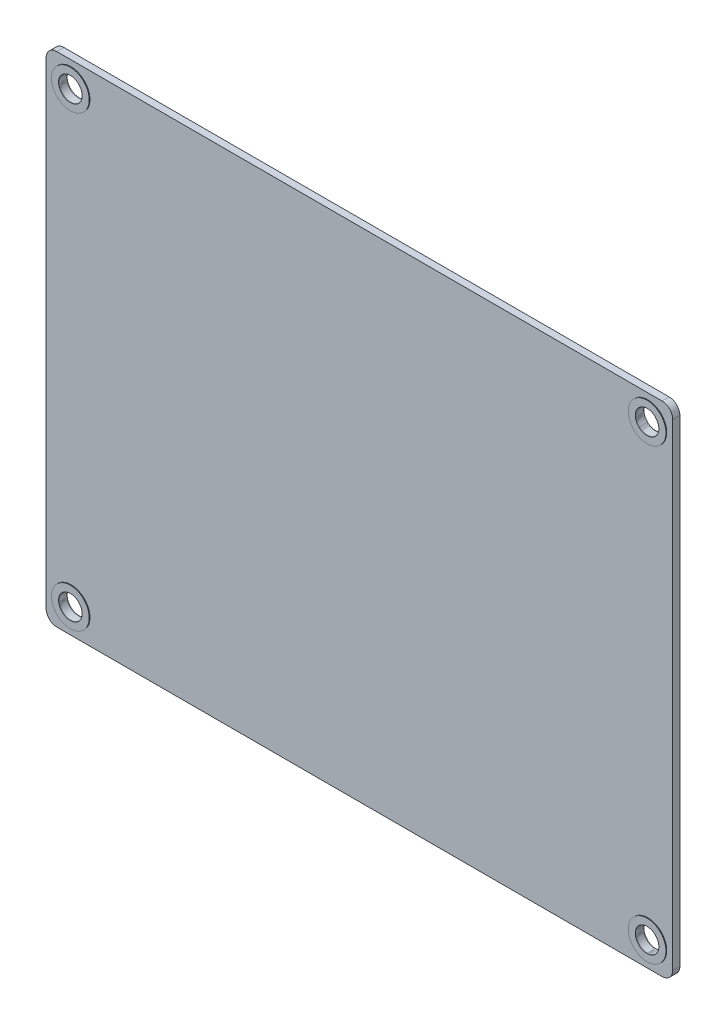
ISO-10303-21;
HEADER;
FILE_DESCRIPTION(('STEP AP214'),'2;1');
FILE_NAME('part.step','',(''),(''),'','','');
FILE_SCHEMA(('AUTOMOTIVE_DESIGN { 1 0 10303 214 1 1 1 1 }'));
ENDSEC;
DATA;
#1=APPLICATION_CONTEXT('core data for automotive mechanical design processes');
#2=APPLICATION_PROTOCOL_DEFINITION('international standard','automotive_design',2000,#1);
#3=PRODUCT_CONTEXT('',#1,'mechanical');
#4=PRODUCT('Part','Part','',(#3));
#5=PRODUCT_RELATED_PRODUCT_CATEGORY('part','',(#4));
#6=PRODUCT_DEFINITION_FORMATION('','',#4);
#7=PRODUCT_DEFINITION_CONTEXT('part definition',#1,'design');
#8=PRODUCT_DEFINITION('design','',#6,#7);
#9=PRODUCT_DEFINITION_SHAPE('','',#8);
#10=(LENGTH_UNIT() NAMED_UNIT(*) SI_UNIT(.MILLI.,.METRE.));
#11=(NAMED_UNIT(*) PLANE_ANGLE_UNIT() SI_UNIT($,.RADIAN.));
#12=(NAMED_UNIT(*) SI_UNIT($,.STERADIAN.) SOLID_ANGLE_UNIT());
#13=UNCERTAINTY_MEASURE_WITH_UNIT(LENGTH_MEASURE(1.E-05),#10,'distance_accuracy_value','');
#14=(GEOMETRIC_REPRESENTATION_CONTEXT(3) GLOBAL_UNCERTAINTY_ASSIGNED_CONTEXT((#13)) GLOBAL_UNIT_ASSIGNED_CONTEXT((#10,
#11,#12)) REPRESENTATION_CONTEXT('',''));
#15=CARTESIAN_POINT('',(0.,0.,0.));
#16=DIRECTION('',(0.,0.,1.));
#17=DIRECTION('',(1.,0.,0.));
#18=AXIS2_PLACEMENT_3D('',#15,#16,#17);
#19=CARTESIAN_POINT('',(36.5,-31.5,-7.6953318805774));
#20=DIRECTION('',(0.,0.,1.));
#21=DIRECTION('',(1.,0.,0.));
#22=AXIS2_PLACEMENT_3D('',#19,#20,#21);
#23=CYLINDRICAL_SURFACE('',#22,2.65);
#24=CARTESIAN_POINT('',(36.5,-31.5,-0.1));
#25=DIRECTION('',(0.,0.,1.));
#26=DIRECTION('',(1.,0.,0.));
#27=AXIS2_PLACEMENT_3D('',#24,#25,#26);
#28=CIRCLE('',#27,2.65);
#29=CARTESIAN_POINT('',(39.15,-31.5,-0.1));
#30=VERTEX_POINT('',#29);
#31=EDGE_CURVE('P0_E50',#30,#30,#28,.F.);
#32=ORIENTED_EDGE('',*,*,#31,.F.);
#33=EDGE_LOOP('',(#32));
#34=FACE_BOUND('',#33,.T.);
#35=CARTESIAN_POINT('',(36.5,-31.5,1.1));
#36=DIRECTION('',(0.,0.,1.));
#37=DIRECTION('',(1.,0.,0.));
#38=AXIS2_PLACEMENT_3D('',#35,#36,#37);
#39=CIRCLE('',#38,2.65);
#40=CARTESIAN_POINT('',(39.15,-31.5,1.1));
#41=VERTEX_POINT('',#40);
#42=EDGE_CURVE('P0_E56',#41,#41,#39,.T.);
#43=ORIENTED_EDGE('',*,*,#42,.F.);
#44=EDGE_LOOP('',(#43));
#45=FACE_BOUND('',#44,.T.);
#46=ADVANCED_FACE('P0_F43',(#34,#45),#23,.T.);
#47=CARTESIAN_POINT('',(36.5,-31.5,-7.6953318805774));
#48=DIRECTION('',(0.,0.,1.));
#49=DIRECTION('',(1.,0.,0.));
#50=AXIS2_PLACEMENT_3D('',#47,#48,#49);
#51=CYLINDRICAL_SURFACE('',#50,1.65);
#52=CARTESIAN_POINT('',(36.5,-31.5,-0.1));
#53=DIRECTION('',(0.,0.,1.));
#54=DIRECTION('',(1.,0.,0.));
#55=AXIS2_PLACEMENT_3D('',#52,#53,#54);
#56=CIRCLE('',#55,1.65);
#57=CARTESIAN_POINT('',(38.15,-31.5,-0.1));
#58=VERTEX_POINT('',#57);
#59=EDGE_CURVE('P0_E11',#58,#58,#56,.F.);
#60=ORIENTED_EDGE('',*,*,#59,.T.);
#61=EDGE_LOOP('',(#60));
#62=FACE_BOUND('',#61,.T.);
#63=CARTESIAN_POINT('',(36.5,-31.5,1.1));
#64=DIRECTION('',(0.,0.,1.));
#65=DIRECTION('',(1.,0.,0.));
#66=AXIS2_PLACEMENT_3D('',#63,#64,#65);
#67=CIRCLE('',#66,1.65);
#68=CARTESIAN_POINT('',(38.15,-31.5,1.1));
#69=VERTEX_POINT('',#68);
#70=EDGE_CURVE('P0_E61',#69,#69,#67,.T.);
#71=ORIENTED_EDGE('',*,*,#70,.T.);
#72=EDGE_LOOP('',(#71));
#73=FACE_BOUND('',#72,.T.);
#74=ADVANCED_FACE('P0_F67',(#62,#73),#51,.F.);
#75=CARTESIAN_POINT('',(0.,0.,-0.1));
#76=DIRECTION('',(0.,0.,1.));
#77=DIRECTION('',(1.,0.,0.));
#78=AXIS2_PLACEMENT_3D('',#75,#76,#77);
#79=PLANE('',#78);
#80=ORIENTED_EDGE('',*,*,#31,.T.);
#81=EDGE_LOOP('',(#80));
#82=FACE_BOUND('',#81,.T.);
#83=ORIENTED_EDGE('',*,*,#59,.F.);
#84=EDGE_LOOP('',(#83));
#85=FACE_BOUND('',#84,.T.);
#86=ADVANCED_FACE('P0_F71',(#82,#85),#79,.F.);
#87=CARTESIAN_POINT('',(36.5,-31.5,1.1));
#88=DIRECTION('',(0.,0.,1.));
#89=DIRECTION('',(1.,0.,0.));
#90=AXIS2_PLACEMENT_3D('',#87,#88,#89);
#91=PLANE('',#90);
#92=ORIENTED_EDGE('',*,*,#42,.T.);
#93=EDGE_LOOP('',(#92));
#94=FACE_BOUND('',#93,.T.);
#95=ORIENTED_EDGE('',*,*,#70,.F.);
#96=EDGE_LOOP('',(#95));
#97=FACE_BOUND('',#96,.T.);
#98=ADVANCED_FACE('P0_F69',(#94,#97),#91,.T.);
#99=CLOSED_SHELL('',(#46,#74,#86,#98));
#100=MANIFOLD_SOLID_BREP('P0_B2',#99);
#101=CARTESIAN_POINT('',(-44.5,-31.5,-7.6953318805774));
#102=DIRECTION('',(0.,0.,1.));
#103=DIRECTION('',(1.,0.,0.));
#104=AXIS2_PLACEMENT_3D('',#101,#102,#103);
#105=CYLINDRICAL_SURFACE('',#104,2.65);
#106=CARTESIAN_POINT('',(-44.5,-31.5,-0.1));
#107=DIRECTION('',(0.,0.,1.));
#108=DIRECTION('',(1.,0.,0.));
#109=AXIS2_PLACEMENT_3D('',#106,#107,#108);
#110=CIRCLE('',#109,2.65);
#111=CARTESIAN_POINT('',(-41.85,-31.5,-0.1));
#112=VERTEX_POINT('',#111);
#113=EDGE_CURVE('P0_E127',#112,#112,#110,.F.);
#114=ORIENTED_EDGE('',*,*,#113,.F.);
#115=EDGE_LOOP('',(#114));
#116=FACE_BOUND('',#115,.T.);
#117=CARTESIAN_POINT('',(-44.5,-31.5,1.1));
#118=DIRECTION('',(0.,0.,1.));
#119=DIRECTION('',(1.,0.,0.));
#120=AXIS2_PLACEMENT_3D('',#117,#118,#119);
#121=CIRCLE('',#120,2.65);
#122=CARTESIAN_POINT('',(-41.85,-31.5,1.1));
#123=VERTEX_POINT('',#122);
#124=EDGE_CURVE('P0_E133',#123,#123,#121,.T.);
#125=ORIENTED_EDGE('',*,*,#124,.F.);
#126=EDGE_LOOP('',(#125));
#127=FACE_BOUND('',#126,.T.);
#128=ADVANCED_FACE('P0_F120',(#116,#127),#105,.T.);
#129=CARTESIAN_POINT('',(-44.5,-31.5,-7.6953318805774));
#130=DIRECTION('',(0.,0.,1.));
#131=DIRECTION('',(1.,0.,0.));
#132=AXIS2_PLACEMENT_3D('',#129,#130,#131);
#133=CYLINDRICAL_SURFACE('',#132,1.65);
#134=CARTESIAN_POINT('',(-44.5,-31.5,-0.1));
#135=DIRECTION('',(0.,0.,1.));
#136=DIRECTION('',(1.,0.,0.));
#137=AXIS2_PLACEMENT_3D('',#134,#135,#136);
#138=CIRCLE('',#137,1.65);
#139=CARTESIAN_POINT('',(-42.85,-31.5,-0.1));
#140=VERTEX_POINT('',#139);
#141=EDGE_CURVE('P0_E42',#140,#140,#138,.F.);
#142=ORIENTED_EDGE('',*,*,#141,.T.);
#143=EDGE_LOOP('',(#142));
#144=FACE_BOUND('',#143,.T.);
#145=CARTESIAN_POINT('',(-44.5,-31.5,1.1));
#146=DIRECTION('',(0.,0.,1.));
#147=DIRECTION('',(1.,0.,0.));
#148=AXIS2_PLACEMENT_3D('',#145,#146,#147);
#149=CIRCLE('',#148,1.65);
#150=CARTESIAN_POINT('',(-42.85,-31.5,1.1));
#151=VERTEX_POINT('',#150);
#152=EDGE_CURVE('P0_E137',#151,#151,#149,.T.);
#153=ORIENTED_EDGE('',*,*,#152,.T.);
#154=EDGE_LOOP('',(#153));
#155=FACE_BOUND('',#154,.T.);
#156=ADVANCED_FACE('P0_F144',(#144,#155),#133,.F.);
#157=CARTESIAN_POINT('',(0.,0.,-0.1));
#158=DIRECTION('',(0.,0.,1.));
#159=DIRECTION('',(1.,0.,0.));
#160=AXIS2_PLACEMENT_3D('',#157,#158,#159);
#161=PLANE('',#160);
#162=ORIENTED_EDGE('',*,*,#113,.T.);
#163=EDGE_LOOP('',(#162));
#164=FACE_BOUND('',#163,.T.);
#165=ORIENTED_EDGE('',*,*,#141,.F.);
#166=EDGE_LOOP('',(#165));
#167=FACE_BOUND('',#166,.T.);
#168=ADVANCED_FACE('P0_F148',(#164,#167),#161,.F.);
#169=CARTESIAN_POINT('',(-44.5,-31.5,1.1));
#170=DIRECTION('',(0.,0.,1.));
#171=DIRECTION('',(1.,0.,0.));
#172=AXIS2_PLACEMENT_3D('',#169,#170,#171);
#173=PLANE('',#172);
#174=ORIENTED_EDGE('',*,*,#124,.T.);
#175=EDGE_LOOP('',(#174));
#176=FACE_BOUND('',#175,.T.);
#177=ORIENTED_EDGE('',*,*,#152,.F.);
#178=EDGE_LOOP('',(#177));
#179=FACE_BOUND('',#178,.T.);
#180=ADVANCED_FACE('P0_F146',(#176,#179),#173,.T.);
#181=CLOSED_SHELL('',(#128,#156,#168,#180));
#182=MANIFOLD_SOLID_BREP('P0_B6',#181);
#183=CARTESIAN_POINT('',(36.5,31.5,-7.6953318805774));
#184=DIRECTION('',(0.,0.,1.));
#185=DIRECTION('',(1.,0.,0.));
#186=AXIS2_PLACEMENT_3D('',#183,#184,#185);
#187=CYLINDRICAL_SURFACE('',#186,2.65);
#188=CARTESIAN_POINT('',(36.5,31.5,-0.1));
#189=DIRECTION('',(0.,0.,1.));
#190=DIRECTION('',(1.,0.,0.));
#191=AXIS2_PLACEMENT_3D('',#188,#189,#190);
#192=CIRCLE('',#191,2.65);
#193=CARTESIAN_POINT('',(39.15,31.5,-0.1));
#194=VERTEX_POINT('',#193);
#195=EDGE_CURVE('P0_E203',#194,#194,#192,.F.);
#196=ORIENTED_EDGE('',*,*,#195,.F.);
#197=EDGE_LOOP('',(#196));
#198=FACE_BOUND('',#197,.T.);
#199=CARTESIAN_POINT('',(36.5,31.5,1.1));
#200=DIRECTION('',(0.,0.,1.));
#201=DIRECTION('',(1.,0.,0.));
#202=AXIS2_PLACEMENT_3D('',#199,#200,#201);
#203=CIRCLE('',#202,2.65);
#204=CARTESIAN_POINT('',(39.15,31.5,1.1));
#205=VERTEX_POINT('',#204);
#206=EDGE_CURVE('P0_E209',#205,#205,#203,.T.);
#207=ORIENTED_EDGE('',*,*,#206,.F.);
#208=EDGE_LOOP('',(#207));
#209=FACE_BOUND('',#208,.T.);
#210=ADVANCED_FACE('P0_F196',(#198,#209),#187,.T.);
#211=CARTESIAN_POINT('',(36.5,31.5,-7.6953318805774));
#212=DIRECTION('',(0.,0.,1.));
#213=DIRECTION('',(1.,0.,0.));
#214=AXIS2_PLACEMENT_3D('',#211,#212,#213);
#215=CYLINDRICAL_SURFACE('',#214,1.65);
#216=CARTESIAN_POINT('',(36.5,31.5,-0.1));
#217=DIRECTION('',(0.,0.,1.));
#218=DIRECTION('',(1.,0.,0.));
#219=AXIS2_PLACEMENT_3D('',#216,#217,#218);
#220=CIRCLE('',#219,1.65);
#221=CARTESIAN_POINT('',(38.15,31.5,-0.1));
#222=VERTEX_POINT('',#221);
#223=EDGE_CURVE('P0_E119',#222,#222,#220,.F.);
#224=ORIENTED_EDGE('',*,*,#223,.T.);
#225=EDGE_LOOP('',(#224));
#226=FACE_BOUND('',#225,.T.);
#227=CARTESIAN_POINT('',(36.5,31.5,1.1));
#228=DIRECTION('',(0.,0.,1.));
#229=DIRECTION('',(1.,0.,0.));
#230=AXIS2_PLACEMENT_3D('',#227,#228,#229);
#231=CIRCLE('',#230,1.65);
#232=CARTESIAN_POINT('',(38.15,31.5,1.1));
#233=VERTEX_POINT('',#232);
#234=EDGE_CURVE('P0_E214',#233,#233,#231,.T.);
#235=ORIENTED_EDGE('',*,*,#234,.T.);
#236=EDGE_LOOP('',(#235));
#237=FACE_BOUND('',#236,.T.);
#238=ADVANCED_FACE('P0_F220',(#226,#237),#215,.F.);
#239=CARTESIAN_POINT('',(0.,0.,-0.1));
#240=DIRECTION('',(0.,0.,1.));
#241=DIRECTION('',(1.,0.,0.));
#242=AXIS2_PLACEMENT_3D('',#239,#240,#241);
#243=PLANE('',#242);
#244=ORIENTED_EDGE('',*,*,#195,.T.);
#245=EDGE_LOOP('',(#244));
#246=FACE_BOUND('',#245,.T.);
#247=ORIENTED_EDGE('',*,*,#223,.F.);
#248=EDGE_LOOP('',(#247));
#249=FACE_BOUND('',#248,.T.);
#250=ADVANCED_FACE('P0_F224',(#246,#249),#243,.F.);
#251=CARTESIAN_POINT('',(36.5,31.5,1.1));
#252=DIRECTION('',(0.,0.,1.));
#253=DIRECTION('',(1.,0.,0.));
#254=AXIS2_PLACEMENT_3D('',#251,#252,#253);
#255=PLANE('',#254);
#256=ORIENTED_EDGE('',*,*,#206,.T.);
#257=EDGE_LOOP('',(#256));
#258=FACE_BOUND('',#257,.T.);
#259=ORIENTED_EDGE('',*,*,#234,.F.);
#260=EDGE_LOOP('',(#259));
#261=FACE_BOUND('',#260,.T.);
#262=ADVANCED_FACE('P0_F222',(#258,#261),#255,.T.);
#263=CLOSED_SHELL('',(#210,#238,#250,#262));
#264=MANIFOLD_SOLID_BREP('P0_B37',#263);
#265=CARTESIAN_POINT('',(-44.5,31.5,-7.6953318805774));
#266=DIRECTION('',(0.,0.,1.));
#267=DIRECTION('',(1.,0.,0.));
#268=AXIS2_PLACEMENT_3D('',#265,#266,#267);
#269=CYLINDRICAL_SURFACE('',#268,2.65);
#270=CARTESIAN_POINT('',(-44.5,31.5,-0.1));
#271=DIRECTION('',(0.,0.,1.));
#272=DIRECTION('',(1.,0.,0.));
#273=AXIS2_PLACEMENT_3D('',#270,#271,#272);
#274=CIRCLE('',#273,2.65);
#275=CARTESIAN_POINT('',(-41.85,31.5,-0.1));
#276=VERTEX_POINT('',#275);
#277=EDGE_CURVE('P0_E272',#276,#276,#274,.F.);
#278=ORIENTED_EDGE('',*,*,#277,.F.);
#279=EDGE_LOOP('',(#278));
#280=FACE_BOUND('',#279,.T.);
#281=CARTESIAN_POINT('',(-44.5,31.5,1.1));
#282=DIRECTION('',(0.,0.,1.));
#283=DIRECTION('',(1.,0.,0.));
#284=AXIS2_PLACEMENT_3D('',#281,#282,#283);
#285=CIRCLE('',#284,2.65);
#286=CARTESIAN_POINT('',(-41.85,31.5,1.1));
#287=VERTEX_POINT('',#286);
#288=EDGE_CURVE('P0_E278',#287,#287,#285,.T.);
#289=ORIENTED_EDGE('',*,*,#288,.F.);
#290=EDGE_LOOP('',(#289));
#291=FACE_BOUND('',#290,.T.);
#292=ADVANCED_FACE('P0_F265',(#280,#291),#269,.T.);
#293=CARTESIAN_POINT('',(-44.5,31.5,-7.6953318805774));
#294=DIRECTION('',(0.,0.,1.));
#295=DIRECTION('',(1.,0.,0.));
#296=AXIS2_PLACEMENT_3D('',#293,#294,#295);
#297=CYLINDRICAL_SURFACE('',#296,1.65);
#298=CARTESIAN_POINT('',(-44.5,31.5,-0.1));
#299=DIRECTION('',(0.,0.,1.));
#300=DIRECTION('',(1.,0.,0.));
#301=AXIS2_PLACEMENT_3D('',#298,#299,#300);
#302=CIRCLE('',#301,1.65);
#303=CARTESIAN_POINT('',(-42.85,31.5,-0.1));
#304=VERTEX_POINT('',#303);
#305=EDGE_CURVE('P0_E195',#304,#304,#302,.F.);
#306=ORIENTED_EDGE('',*,*,#305,.T.);
#307=EDGE_LOOP('',(#306));
#308=FACE_BOUND('',#307,.T.);
#309=CARTESIAN_POINT('',(-44.5,31.5,1.1));
#310=DIRECTION('',(0.,0.,1.));
#311=DIRECTION('',(1.,0.,0.));
#312=AXIS2_PLACEMENT_3D('',#309,#310,#311);
#313=CIRCLE('',#312,1.65);
#314=CARTESIAN_POINT('',(-42.85,31.5,1.1));
#315=VERTEX_POINT('',#314);
#316=EDGE_CURVE('P0_E283',#315,#315,#313,.T.);
#317=ORIENTED_EDGE('',*,*,#316,.T.);
#318=EDGE_LOOP('',(#317));
#319=FACE_BOUND('',#318,.T.);
#320=ADVANCED_FACE('P0_F289',(#308,#319),#297,.F.);
#321=CARTESIAN_POINT('',(0.,0.,-0.1));
#322=DIRECTION('',(0.,0.,1.));
#323=DIRECTION('',(1.,0.,0.));
#324=AXIS2_PLACEMENT_3D('',#321,#322,#323);
#325=PLANE('',#324);
#326=ORIENTED_EDGE('',*,*,#277,.T.);
#327=EDGE_LOOP('',(#326));
#328=FACE_BOUND('',#327,.T.);
#329=ORIENTED_EDGE('',*,*,#305,.F.);
#330=EDGE_LOOP('',(#329));
#331=FACE_BOUND('',#330,.T.);
#332=ADVANCED_FACE('P0_F293',(#328,#331),#325,.F.);
#333=CARTESIAN_POINT('',(-44.5,31.5,1.1));
#334=DIRECTION('',(0.,0.,1.));
#335=DIRECTION('',(1.,0.,0.));
#336=AXIS2_PLACEMENT_3D('',#333,#334,#335);
#337=PLANE('',#336);
#338=ORIENTED_EDGE('',*,*,#288,.T.);
#339=EDGE_LOOP('',(#338));
#340=FACE_BOUND('',#339,.T.);
#341=ORIENTED_EDGE('',*,*,#316,.F.);
#342=EDGE_LOOP('',(#341));
#343=FACE_BOUND('',#342,.T.);
#344=ADVANCED_FACE('P0_F291',(#340,#343),#337,.T.);
#345=CLOSED_SHELL('',(#292,#320,#332,#344));
#346=MANIFOLD_SOLID_BREP('P0_B114',#345);
#347=CARTESIAN_POINT('',(0.,0.,1.));
#348=DIRECTION('',(0.,0.,1.));
#349=DIRECTION('',(1.,0.,0.));
#350=AXIS2_PLACEMENT_3D('',#347,#348,#349);
#351=PLANE('',#350);
#352=CARTESIAN_POINT('',(36.5,-31.5,1.));
#353=DIRECTION('',(0.,0.,1.));
#354=DIRECTION('',(1.,0.,0.));
#355=AXIS2_PLACEMENT_3D('',#352,#353,#354);
#356=CIRCLE('',#355,1.65);
#357=CARTESIAN_POINT('',(38.15,-31.5,1.));
#358=VERTEX_POINT('',#357);
#359=EDGE_CURVE('P1_E153',#358,#358,#356,.F.);
#360=ORIENTED_EDGE('',*,*,#359,.T.);
#361=EDGE_LOOP('',(#360));
#362=FACE_BOUND('',#361,.T.);
#363=CARTESIAN_POINT('',(-44.5,-31.5,1.));
#364=DIRECTION('',(0.,0.,1.));
#365=DIRECTION('',(1.,0.,0.));
#366=AXIS2_PLACEMENT_3D('',#363,#364,#365);
#367=CIRCLE('',#366,1.65);
#368=CARTESIAN_POINT('',(-42.85,-31.5,1.));
#369=VERTEX_POINT('',#368);
#370=EDGE_CURVE('P1_E156',#369,#369,#367,.F.);
#371=ORIENTED_EDGE('',*,*,#370,.T.);
#372=EDGE_LOOP('',(#371));
#373=FACE_BOUND('',#372,.T.);
#374=CARTESIAN_POINT('',(36.5,31.5,1.));
#375=DIRECTION('',(0.,0.,1.));
#376=DIRECTION('',(1.,0.,0.));
#377=AXIS2_PLACEMENT_3D('',#374,#375,#376);
#378=CIRCLE('',#377,1.65);
#379=CARTESIAN_POINT('',(38.15,31.5,1.));
#380=VERTEX_POINT('',#379);
#381=EDGE_CURVE('P1_E160',#380,#380,#378,.F.);
#382=ORIENTED_EDGE('',*,*,#381,.T.);
#383=EDGE_LOOP('',(#382));
#384=FACE_BOUND('',#383,.T.);
#385=CARTESIAN_POINT('',(-44.5,31.5,1.));
#386=DIRECTION('',(0.,0.,1.));
#387=DIRECTION('',(1.,0.,0.));
#388=AXIS2_PLACEMENT_3D('',#385,#386,#387);
#389=CIRCLE('',#388,1.65);
#390=CARTESIAN_POINT('',(-42.85,31.5,1.));
#391=VERTEX_POINT('',#390);
#392=EDGE_CURVE('P1_E164',#391,#391,#389,.F.);
#393=ORIENTED_EDGE('',*,*,#392,.T.);
#394=EDGE_LOOP('',(#393));
#395=FACE_BOUND('',#394,.T.);
#396=DIRECTION('',(0.,1.,0.));
#397=VECTOR('',#396,1.);
#398=CARTESIAN_POINT('',(40.,-35.,1.));
#399=LINE('',#398,#397);
#400=CARTESIAN_POINT('',(40.,33.5,1.));
#401=VERTEX_POINT('',#400);
#402=CARTESIAN_POINT('',(40.,-33.5,1.));
#403=VERTEX_POINT('',#402);
#404=EDGE_CURVE('P1_E95',#401,#403,#399,.F.);
#405=ORIENTED_EDGE('',*,*,#404,.F.);
#406=CARTESIAN_POINT('',(38.5,33.5,1.));
#407=DIRECTION('',(0.,0.,-1.));
#408=DIRECTION('',(-1.,0.,0.));
#409=AXIS2_PLACEMENT_3D('',#406,#407,#408);
#410=CIRCLE('',#409,1.5);
#411=CARTESIAN_POINT('',(38.5,35.,1.));
#412=VERTEX_POINT('',#411);
#413=EDGE_CURVE('P1_E20',#412,#401,#410,.T.);
#414=ORIENTED_EDGE('',*,*,#413,.F.);
#415=DIRECTION('',(1.,0.,0.));
#416=VECTOR('',#415,1.);
#417=CARTESIAN_POINT('',(40.,35.,1.));
#418=LINE('',#417,#416);
#419=CARTESIAN_POINT('',(-46.5,35.,1.));
#420=VERTEX_POINT('',#419);
#421=EDGE_CURVE('P1_E80',#420,#412,#418,.T.);
#422=ORIENTED_EDGE('',*,*,#421,.F.);
#423=CARTESIAN_POINT('',(-46.5,33.5,1.));
#424=DIRECTION('',(0.,0.,-1.));
#425=DIRECTION('',(-1.,0.,0.));
#426=AXIS2_PLACEMENT_3D('',#423,#424,#425);
#427=CIRCLE('',#426,1.5);
#428=CARTESIAN_POINT('',(-48.,33.5,1.));
#429=VERTEX_POINT('',#428);
#430=EDGE_CURVE('P1_E104',#429,#420,#427,.T.);
#431=ORIENTED_EDGE('',*,*,#430,.F.);
#432=DIRECTION('',(0.,1.,0.));
#433=VECTOR('',#432,1.);
#434=CARTESIAN_POINT('',(-48.,35.,1.));
#435=LINE('',#434,#433);
#436=CARTESIAN_POINT('',(-48.,-33.5,1.));
#437=VERTEX_POINT('',#436);
#438=EDGE_CURVE('P1_E120',#437,#429,#435,.T.);
#439=ORIENTED_EDGE('',*,*,#438,.F.);
#440=CARTESIAN_POINT('',(-46.5,-33.5,1.));
#441=DIRECTION('',(0.,0.,-1.));
#442=DIRECTION('',(-1.,0.,0.));
#443=AXIS2_PLACEMENT_3D('',#440,#441,#442);
#444=CIRCLE('',#443,1.5);
#445=CARTESIAN_POINT('',(-46.5,-35.,1.));
#446=VERTEX_POINT('',#445);
#447=EDGE_CURVE('P1_E172',#446,#437,#444,.T.);
#448=ORIENTED_EDGE('',*,*,#447,.F.);
#449=DIRECTION('',(1.,0.,0.));
#450=VECTOR('',#449,1.);
#451=CARTESIAN_POINT('',(-48.,-35.,1.));
#452=LINE('',#451,#450);
#453=CARTESIAN_POINT('',(38.5,-35.,1.));
#454=VERTEX_POINT('',#453);
#455=EDGE_CURVE('P1_E115',#454,#446,#452,.F.);
#456=ORIENTED_EDGE('',*,*,#455,.F.);
#457=CARTESIAN_POINT('',(38.5,-33.5,1.));
#458=DIRECTION('',(0.,0.,-1.));
#459=DIRECTION('',(-1.,0.,0.));
#460=AXIS2_PLACEMENT_3D('',#457,#458,#459);
#461=CIRCLE('',#460,1.5);
#462=EDGE_CURVE('P1_E169',#403,#454,#461,.T.);
#463=ORIENTED_EDGE('',*,*,#462,.F.);
#464=EDGE_LOOP('',(#405,#414,#422,#431,#439,#448,#456,#463));
#465=FACE_BOUND('',#464,.T.);
#466=ADVANCED_FACE('P1_F17',(#362,#373,#384,#395,#465),#351,.T.);
#467=CARTESIAN_POINT('',(38.5,33.5,2.9048));
#468=DIRECTION('',(0.,0.,-1.));
#469=DIRECTION('',(-1.,0.,0.));
#470=AXIS2_PLACEMENT_3D('',#467,#468,#469);
#471=CYLINDRICAL_SURFACE('',#470,1.5);
#472=DIRECTION('',(0.,0.,-1.));
#473=VECTOR('',#472,1.);
#474=CARTESIAN_POINT('',(40.,33.5,0.));
#475=LINE('',#474,#473);
#476=CARTESIAN_POINT('',(40.,33.5,0.));
#477=VERTEX_POINT('',#476);
#478=EDGE_CURVE('P1_E168',#477,#401,#475,.F.);
#479=ORIENTED_EDGE('',*,*,#478,.F.);
#480=CARTESIAN_POINT('',(38.5,33.5,0.));
#481=DIRECTION('',(0.,0.,-1.));
#482=DIRECTION('',(-1.,0.,0.));
#483=AXIS2_PLACEMENT_3D('',#480,#481,#482);
#484=CIRCLE('',#483,1.5);
#485=CARTESIAN_POINT('',(38.5,35.,0.));
#486=VERTEX_POINT('',#485);
#487=EDGE_CURVE('P1_E102',#477,#486,#484,.F.);
#488=ORIENTED_EDGE('',*,*,#487,.T.);
#489=DIRECTION('',(0.,0.,1.));
#490=VECTOR('',#489,1.);
#491=CARTESIAN_POINT('',(38.5,35.,0.));
#492=LINE('',#491,#490);
#493=EDGE_CURVE('P1_E85',#412,#486,#492,.F.);
#494=ORIENTED_EDGE('',*,*,#493,.F.);
#495=ORIENTED_EDGE('',*,*,#413,.T.);
#496=EDGE_LOOP('',(#479,#488,#494,#495));
#497=FACE_BOUND('',#496,.T.);
#498=ADVANCED_FACE('P1_F101',(#497),#471,.T.);
#499=CARTESIAN_POINT('',(40.,35.,0.));
#500=DIRECTION('',(0.,1.,0.));
#501=DIRECTION('',(0.,0.,1.));
#502=AXIS2_PLACEMENT_3D('',#499,#500,#501);
#503=PLANE('',#502);
#504=ORIENTED_EDGE('',*,*,#421,.T.);
#505=ORIENTED_EDGE('',*,*,#493,.T.);
#506=DIRECTION('',(1.,0.,0.));
#507=VECTOR('',#506,1.);
#508=CARTESIAN_POINT('',(0.,35.,0.));
#509=LINE('',#508,#507);
#510=CARTESIAN_POINT('',(-46.5,35.,0.));
#511=VERTEX_POINT('',#510);
#512=EDGE_CURVE('P1_E150',#486,#511,#509,.F.);
#513=ORIENTED_EDGE('',*,*,#512,.T.);
#514=DIRECTION('',(0.,0.,-1.));
#515=VECTOR('',#514,1.);
#516=CARTESIAN_POINT('',(-46.5,35.,2.9048));
#517=LINE('',#516,#515);
#518=EDGE_CURVE('P1_E87',#420,#511,#517,.T.);
#519=ORIENTED_EDGE('',*,*,#518,.F.);
#520=EDGE_LOOP('',(#504,#505,#513,#519));
#521=FACE_BOUND('',#520,.T.);
#522=ADVANCED_FACE('P1_F82',(#521),#503,.T.);
#523=CARTESIAN_POINT('',(-46.5,33.5,2.9048));
#524=DIRECTION('',(0.,0.,-1.));
#525=DIRECTION('',(-1.,0.,0.));
#526=AXIS2_PLACEMENT_3D('',#523,#524,#525);
#527=CYLINDRICAL_SURFACE('',#526,1.5);
#528=ORIENTED_EDGE('',*,*,#518,.T.);
#529=CARTESIAN_POINT('',(-46.5,33.5,0.));
#530=DIRECTION('',(0.,0.,-1.));
#531=DIRECTION('',(-1.,0.,0.));
#532=AXIS2_PLACEMENT_3D('',#529,#530,#531);
#533=CIRCLE('',#532,1.5);
#534=CARTESIAN_POINT('',(-48.,33.5,0.));
#535=VERTEX_POINT('',#534);
#536=EDGE_CURVE('P1_E146',#511,#535,#533,.F.);
#537=ORIENTED_EDGE('',*,*,#536,.T.);
#538=DIRECTION('',(0.,0.,1.));
#539=VECTOR('',#538,1.);
#540=CARTESIAN_POINT('',(-48.,33.5,0.));
#541=LINE('',#540,#539);
#542=EDGE_CURVE('P1_E122',#429,#535,#541,.F.);
#543=ORIENTED_EDGE('',*,*,#542,.F.);
#544=ORIENTED_EDGE('',*,*,#430,.T.);
#545=EDGE_LOOP('',(#528,#537,#543,#544));
#546=FACE_BOUND('',#545,.T.);
#547=ADVANCED_FACE('P1_F219',(#546),#527,.T.);
#548=CARTESIAN_POINT('',(-48.,35.,0.));
#549=DIRECTION('',(-1.,0.,0.));
#550=DIRECTION('',(0.,0.,1.));
#551=AXIS2_PLACEMENT_3D('',#548,#549,#550);
#552=PLANE('',#551);
#553=DIRECTION('',(0.,1.,0.));
#554=VECTOR('',#553,1.);
#555=CARTESIAN_POINT('',(-48.,0.,0.));
#556=LINE('',#555,#554);
#557=CARTESIAN_POINT('',(-48.,-33.5,0.));
#558=VERTEX_POINT('',#557);
#559=EDGE_CURVE('P1_E145',#535,#558,#556,.F.);
#560=ORIENTED_EDGE('',*,*,#559,.T.);
#561=DIRECTION('',(0.,0.,-1.));
#562=VECTOR('',#561,1.);
#563=CARTESIAN_POINT('',(-48.,-33.5,2.9048));
#564=LINE('',#563,#562);
#565=EDGE_CURVE('P1_E119',#437,#558,#564,.T.);
#566=ORIENTED_EDGE('',*,*,#565,.F.);
#567=ORIENTED_EDGE('',*,*,#438,.T.);
#568=ORIENTED_EDGE('',*,*,#542,.T.);
#569=EDGE_LOOP('',(#560,#566,#567,#568));
#570=FACE_BOUND('',#569,.T.);
#571=ADVANCED_FACE('P1_F216',(#570),#552,.T.);
#572=CARTESIAN_POINT('',(-46.5,-33.5,2.9048));
#573=DIRECTION('',(0.,0.,-1.));
#574=DIRECTION('',(-1.,0.,0.));
#575=AXIS2_PLACEMENT_3D('',#572,#573,#574);
#576=CYLINDRICAL_SURFACE('',#575,1.5);
#577=ORIENTED_EDGE('',*,*,#565,.T.);
#578=CARTESIAN_POINT('',(-46.5,-33.5,0.));
#579=DIRECTION('',(0.,0.,-1.));
#580=DIRECTION('',(-1.,0.,0.));
#581=AXIS2_PLACEMENT_3D('',#578,#579,#580);
#582=CIRCLE('',#581,1.5);
#583=CARTESIAN_POINT('',(-46.5,-35.,0.));
#584=VERTEX_POINT('',#583);
#585=EDGE_CURVE('P1_E141',#558,#584,#582,.F.);
#586=ORIENTED_EDGE('',*,*,#585,.T.);
#587=DIRECTION('',(0.,0.,-1.));
#588=VECTOR('',#587,1.);
#589=CARTESIAN_POINT('',(-46.5,-35.,0.));
#590=LINE('',#589,#588);
#591=EDGE_CURVE('P1_E118',#446,#584,#590,.T.);
#592=ORIENTED_EDGE('',*,*,#591,.F.);
#593=ORIENTED_EDGE('',*,*,#447,.T.);
#594=EDGE_LOOP('',(#577,#586,#592,#593));
#595=FACE_BOUND('',#594,.T.);
#596=ADVANCED_FACE('P1_F214',(#595),#576,.T.);
#597=CARTESIAN_POINT('',(-48.,-35.,0.));
#598=DIRECTION('',(0.,-1.,0.));
#599=DIRECTION('',(0.,0.,-1.));
#600=AXIS2_PLACEMENT_3D('',#597,#598,#599);
#601=PLANE('',#600);
#602=DIRECTION('',(1.,0.,0.));
#603=VECTOR('',#602,1.);
#604=CARTESIAN_POINT('',(0.,-35.,0.));
#605=LINE('',#604,#603);
#606=CARTESIAN_POINT('',(38.5,-35.,0.));
#607=VERTEX_POINT('',#606);
#608=EDGE_CURVE('P1_E140',#584,#607,#605,.T.);
#609=ORIENTED_EDGE('',*,*,#608,.T.);
#610=DIRECTION('',(0.,0.,-1.));
#611=VECTOR('',#610,1.);
#612=CARTESIAN_POINT('',(38.5,-35.,2.9048));
#613=LINE('',#612,#611);
#614=EDGE_CURVE('P1_E114',#454,#607,#613,.T.);
#615=ORIENTED_EDGE('',*,*,#614,.F.);
#616=ORIENTED_EDGE('',*,*,#455,.T.);
#617=ORIENTED_EDGE('',*,*,#591,.T.);
#618=EDGE_LOOP('',(#609,#615,#616,#617));
#619=FACE_BOUND('',#618,.T.);
#620=ADVANCED_FACE('P1_F212',(#619),#601,.T.);
#621=CARTESIAN_POINT('',(38.5,-33.5,2.9048));
#622=DIRECTION('',(0.,0.,-1.));
#623=DIRECTION('',(-1.,0.,0.));
#624=AXIS2_PLACEMENT_3D('',#621,#622,#623);
#625=CYLINDRICAL_SURFACE('',#624,1.5);
#626=ORIENTED_EDGE('',*,*,#614,.T.);
#627=CARTESIAN_POINT('',(38.5,-33.5,0.));
#628=DIRECTION('',(0.,0.,-1.));
#629=DIRECTION('',(-1.,0.,0.));
#630=AXIS2_PLACEMENT_3D('',#627,#628,#629);
#631=CIRCLE('',#630,1.5);
#632=CARTESIAN_POINT('',(40.,-33.5,0.));
#633=VERTEX_POINT('',#632);
#634=EDGE_CURVE('P1_E136',#607,#633,#631,.F.);
#635=ORIENTED_EDGE('',*,*,#634,.T.);
#636=DIRECTION('',(0.,0.,-1.));
#637=VECTOR('',#636,1.);
#638=CARTESIAN_POINT('',(40.,-33.5,0.));
#639=LINE('',#638,#637);
#640=EDGE_CURVE('P1_E36',#403,#633,#639,.T.);
#641=ORIENTED_EDGE('',*,*,#640,.F.);
#642=ORIENTED_EDGE('',*,*,#462,.T.);
#643=EDGE_LOOP('',(#626,#635,#641,#642));
#644=FACE_BOUND('',#643,.T.);
#645=ADVANCED_FACE('P1_F208',(#644),#625,.T.);
#646=CARTESIAN_POINT('',(40.,-35.,0.));
#647=DIRECTION('',(1.,0.,0.));
#648=DIRECTION('',(0.,0.,-1.));
#649=AXIS2_PLACEMENT_3D('',#646,#647,#648);
#650=PLANE('',#649);
#651=DIRECTION('',(0.,1.,0.));
#652=VECTOR('',#651,1.);
#653=CARTESIAN_POINT('',(40.,0.,0.));
#654=LINE('',#653,#652);
#655=EDGE_CURVE('P1_E135',#633,#477,#654,.T.);
#656=ORIENTED_EDGE('',*,*,#655,.T.);
#657=ORIENTED_EDGE('',*,*,#478,.T.);
#658=ORIENTED_EDGE('',*,*,#404,.T.);
#659=ORIENTED_EDGE('',*,*,#640,.T.);
#660=EDGE_LOOP('',(#656,#657,#658,#659));
#661=FACE_BOUND('',#660,.T.);
#662=ADVANCED_FACE('P1_F202',(#661),#650,.T.);
#663=CARTESIAN_POINT('',(-44.5,31.5,1.));
#664=DIRECTION('',(0.,0.,1.));
#665=DIRECTION('',(1.,0.,0.));
#666=AXIS2_PLACEMENT_3D('',#663,#664,#665);
#667=CYLINDRICAL_SURFACE('',#666,1.65);
#668=ORIENTED_EDGE('',*,*,#392,.F.);
#669=EDGE_LOOP('',(#668));
#670=FACE_BOUND('',#669,.T.);
#671=CARTESIAN_POINT('',(-44.5,31.5,0.));
#672=DIRECTION('',(0.,0.,1.));
#673=DIRECTION('',(1.,0.,0.));
#674=AXIS2_PLACEMENT_3D('',#671,#672,#673);
#675=CIRCLE('',#674,1.65);
#676=CARTESIAN_POINT('',(-42.85,31.5,0.));
#677=VERTEX_POINT('',#676);
#678=EDGE_CURVE('P1_E131',#677,#677,#675,.F.);
#679=ORIENTED_EDGE('',*,*,#678,.T.);
#680=EDGE_LOOP('',(#679));
#681=FACE_BOUND('',#680,.T.);
#682=ADVANCED_FACE('P1_F249',(#670,#681),#667,.F.);
#683=CARTESIAN_POINT('',(36.5,31.5,1.));
#684=DIRECTION('',(0.,0.,1.));
#685=DIRECTION('',(1.,0.,0.));
#686=AXIS2_PLACEMENT_3D('',#683,#684,#685);
#687=CYLINDRICAL_SURFACE('',#686,1.65);
#688=ORIENTED_EDGE('',*,*,#381,.F.);
#689=EDGE_LOOP('',(#688));
#690=FACE_BOUND('',#689,.T.);
#691=CARTESIAN_POINT('',(36.5,31.5,0.));
#692=DIRECTION('',(0.,0.,1.));
#693=DIRECTION('',(1.,0.,0.));
#694=AXIS2_PLACEMENT_3D('',#691,#692,#693);
#695=CIRCLE('',#694,1.65);
#696=CARTESIAN_POINT('',(38.15,31.5,0.));
#697=VERTEX_POINT('',#696);
#698=EDGE_CURVE('P1_E127',#697,#697,#695,.F.);
#699=ORIENTED_EDGE('',*,*,#698,.T.);
#700=EDGE_LOOP('',(#699));
#701=FACE_BOUND('',#700,.T.);
#702=ADVANCED_FACE('P1_F245',(#690,#701),#687,.F.);
#703=CARTESIAN_POINT('',(-44.5,-31.5,1.));
#704=DIRECTION('',(0.,0.,1.));
#705=DIRECTION('',(1.,0.,0.));
#706=AXIS2_PLACEMENT_3D('',#703,#704,#705);
#707=CYLINDRICAL_SURFACE('',#706,1.65);
#708=ORIENTED_EDGE('',*,*,#370,.F.);
#709=EDGE_LOOP('',(#708));
#710=FACE_BOUND('',#709,.T.);
#711=CARTESIAN_POINT('',(-44.5,-31.5,0.));
#712=DIRECTION('',(0.,0.,1.));
#713=DIRECTION('',(1.,0.,0.));
#714=AXIS2_PLACEMENT_3D('',#711,#712,#713);
#715=CIRCLE('',#714,1.65);
#716=CARTESIAN_POINT('',(-42.85,-31.5,0.));
#717=VERTEX_POINT('',#716);
#718=EDGE_CURVE('P1_E27',#717,#717,#715,.F.);
#719=ORIENTED_EDGE('',*,*,#718,.T.);
#720=EDGE_LOOP('',(#719));
#721=FACE_BOUND('',#720,.T.);
#722=ADVANCED_FACE('P1_F237',(#710,#721),#707,.F.);
#723=CARTESIAN_POINT('',(36.5,-31.5,1.));
#724=DIRECTION('',(0.,0.,1.));
#725=DIRECTION('',(1.,0.,0.));
#726=AXIS2_PLACEMENT_3D('',#723,#724,#725);
#727=CYLINDRICAL_SURFACE('',#726,1.65);
#728=ORIENTED_EDGE('',*,*,#359,.F.);
#729=EDGE_LOOP('',(#728));
#730=FACE_BOUND('',#729,.T.);
#731=CARTESIAN_POINT('',(36.5,-31.5,0.));
#732=DIRECTION('',(0.,0.,1.));
#733=DIRECTION('',(1.,0.,0.));
#734=AXIS2_PLACEMENT_3D('',#731,#732,#733);
#735=CIRCLE('',#734,1.65);
#736=CARTESIAN_POINT('',(38.15,-31.5,0.));
#737=VERTEX_POINT('',#736);
#738=EDGE_CURVE('P1_E11',#737,#737,#735,.F.);
#739=ORIENTED_EDGE('',*,*,#738,.T.);
#740=EDGE_LOOP('',(#739));
#741=FACE_BOUND('',#740,.T.);
#742=ADVANCED_FACE('P1_F232',(#730,#741),#727,.F.);
#743=CARTESIAN_POINT('',(0.,0.,0.));
#744=DIRECTION('',(0.,0.,1.));
#745=DIRECTION('',(1.,0.,0.));
#746=AXIS2_PLACEMENT_3D('',#743,#744,#745);
#747=PLANE('',#746);
#748=ORIENTED_EDGE('',*,*,#738,.F.);
#749=EDGE_LOOP('',(#748));
#750=FACE_BOUND('',#749,.T.);
#751=ORIENTED_EDGE('',*,*,#718,.F.);
#752=EDGE_LOOP('',(#751));
#753=FACE_BOUND('',#752,.T.);
#754=ORIENTED_EDGE('',*,*,#698,.F.);
#755=EDGE_LOOP('',(#754));
#756=FACE_BOUND('',#755,.T.);
#757=ORIENTED_EDGE('',*,*,#678,.F.);
#758=EDGE_LOOP('',(#757));
#759=FACE_BOUND('',#758,.T.);
#760=ORIENTED_EDGE('',*,*,#634,.F.);
#761=ORIENTED_EDGE('',*,*,#608,.F.);
#762=ORIENTED_EDGE('',*,*,#585,.F.);
#763=ORIENTED_EDGE('',*,*,#559,.F.);
#764=ORIENTED_EDGE('',*,*,#536,.F.);
#765=ORIENTED_EDGE('',*,*,#512,.F.);
#766=ORIENTED_EDGE('',*,*,#487,.F.);
#767=ORIENTED_EDGE('',*,*,#655,.F.);
#768=EDGE_LOOP('',(#760,#761,#762,#763,#764,#765,#766,#767));
#769=FACE_BOUND('',#768,.T.);
#770=ADVANCED_FACE('P1_F205',(#750,#753,#756,#759,#769),#747,.F.);
#771=CLOSED_SHELL('',(#466,#498,#522,#547,#571,#596,#620,#645,#662,#682,#702,#722,#742,#770));
#772=MANIFOLD_SOLID_BREP('P1_B1',#771);
#773=ADVANCED_BREP_SHAPE_REPRESENTATION('',(#18,#100,#182,#264,#346,#772),#14);
#774=SHAPE_DEFINITION_REPRESENTATION(#9,#773);
ENDSEC;
END-ISO-10303-21;
